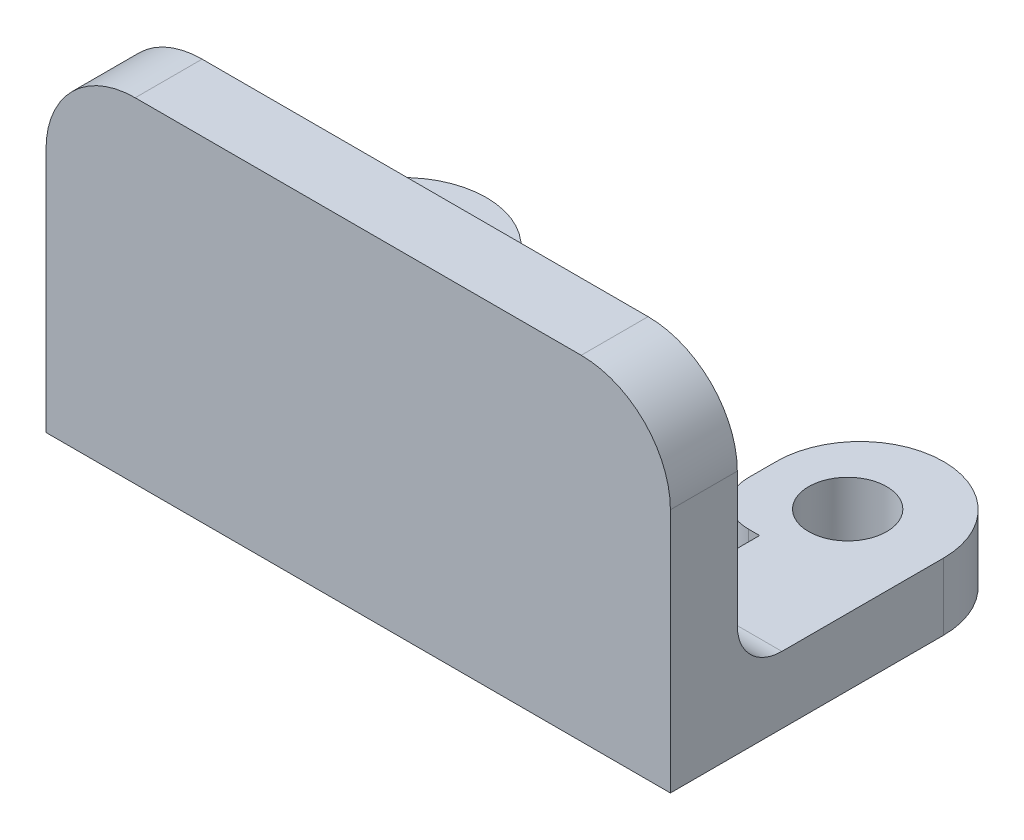
ISO-10303-21;
HEADER;
FILE_DESCRIPTION(('STEP AP214'),'2;1');
FILE_NAME('part.step','',(''),(''),'','','');
FILE_SCHEMA(('AUTOMOTIVE_DESIGN { 1 0 10303 214 1 1 1 1 }'));
ENDSEC;
DATA;
#1=APPLICATION_CONTEXT('core data for automotive mechanical design processes');
#2=APPLICATION_PROTOCOL_DEFINITION('international standard','automotive_design',2000,#1);
#3=PRODUCT_CONTEXT('',#1,'mechanical');
#4=PRODUCT('Part','Part','',(#3));
#5=PRODUCT_RELATED_PRODUCT_CATEGORY('part','',(#4));
#6=PRODUCT_DEFINITION_FORMATION('','',#4);
#7=PRODUCT_DEFINITION_CONTEXT('part definition',#1,'design');
#8=PRODUCT_DEFINITION('design','',#6,#7);
#9=PRODUCT_DEFINITION_SHAPE('','',#8);
#10=(LENGTH_UNIT() NAMED_UNIT(*) SI_UNIT(.MILLI.,.METRE.));
#11=(NAMED_UNIT(*) PLANE_ANGLE_UNIT() SI_UNIT($,.RADIAN.));
#12=(NAMED_UNIT(*) SI_UNIT($,.STERADIAN.) SOLID_ANGLE_UNIT());
#13=UNCERTAINTY_MEASURE_WITH_UNIT(LENGTH_MEASURE(1.E-05),#10,'distance_accuracy_value','');
#14=(GEOMETRIC_REPRESENTATION_CONTEXT(3) GLOBAL_UNCERTAINTY_ASSIGNED_CONTEXT((#13)) GLOBAL_UNIT_ASSIGNED_CONTEXT((#10,
#11,#12)) REPRESENTATION_CONTEXT('',''));
#15=CARTESIAN_POINT('',(0.,0.,0.));
#16=DIRECTION('',(0.,0.,1.));
#17=DIRECTION('',(1.,0.,0.));
#18=AXIS2_PLACEMENT_3D('',#15,#16,#17);
#19=CARTESIAN_POINT('',(-14.,-1.5,8.));
#20=DIRECTION('',(0.,-1.,0.));
#21=DIRECTION('',(0.,0.,-1.));
#22=AXIS2_PLACEMENT_3D('',#19,#20,#21);
#23=PLANE('',#22);
#24=DIRECTION('',(1.,0.,0.));
#25=VECTOR('',#24,1.);
#26=CARTESIAN_POINT('',(-14.,-1.5,-1.00000000000001));
#27=LINE('',#26,#25);
#28=CARTESIAN_POINT('',(8.5,-1.5,-0.999999999999994));
#29=VERTEX_POINT('',#28);
#30=CARTESIAN_POINT('',(9.,-1.5,-0.999999999999994));
#31=VERTEX_POINT('',#30);
#32=EDGE_CURVE('E543',#29,#31,#27,.T.);
#33=ORIENTED_EDGE('',*,*,#32,.F.);
#34=CARTESIAN_POINT('',(8.5,-1.5,-2.99999999999999));
#35=DIRECTION('',(0.,-1.,0.));
#36=DIRECTION('',(0.,0.,-1.));
#37=AXIS2_PLACEMENT_3D('',#34,#35,#36);
#38=CIRCLE('',#37,2.);
#39=CARTESIAN_POINT('',(6.5,-1.5,-2.99999999999999));
#40=VERTEX_POINT('',#39);
#41=EDGE_CURVE('E463',#29,#40,#38,.T.);
#42=ORIENTED_EDGE('',*,*,#41,.T.);
#43=DIRECTION('',(0.,0.,-1.));
#44=VECTOR('',#43,1.);
#45=CARTESIAN_POINT('',(6.5,-1.5,7.99999999999999));
#46=LINE('',#45,#44);
#47=CARTESIAN_POINT('',(6.5,-1.5,-4.25));
#48=VERTEX_POINT('',#47);
#49=EDGE_CURVE('E389',#40,#48,#46,.T.);
#50=ORIENTED_EDGE('',*,*,#49,.T.);
#51=CARTESIAN_POINT('',(10.25,-1.5,-4.25));
#52=DIRECTION('',(0.,-1.,0.));
#53=DIRECTION('',(0.,0.,-1.));
#54=AXIS2_PLACEMENT_3D('',#51,#52,#53);
#55=CIRCLE('',#54,3.75);
#56=CARTESIAN_POINT('',(14.,-1.5,-4.25));
#57=VERTEX_POINT('',#56);
#58=EDGE_CURVE('E381',#48,#57,#55,.T.);
#59=ORIENTED_EDGE('',*,*,#58,.T.);
#60=DIRECTION('',(0.,0.,-1.));
#61=VECTOR('',#60,1.);
#62=CARTESIAN_POINT('',(14.,-1.5,8.));
#63=LINE('',#62,#61);
#64=CARTESIAN_POINT('',(14.,-1.5,8.));
#65=VERTEX_POINT('',#64);
#66=EDGE_CURVE('E369',#65,#57,#63,.T.);
#67=ORIENTED_EDGE('',*,*,#66,.F.);
#68=DIRECTION('',(1.,0.,0.));
#69=VECTOR('',#68,1.);
#70=CARTESIAN_POINT('',(-14.,-1.5,8.));
#71=LINE('',#70,#69);
#72=CARTESIAN_POINT('',(-14.,-1.5,8.));
#73=VERTEX_POINT('',#72);
#74=EDGE_CURVE('E372',#73,#65,#71,.T.);
#75=ORIENTED_EDGE('',*,*,#74,.F.);
#76=DIRECTION('',(0.,0.,-1.));
#77=VECTOR('',#76,1.);
#78=CARTESIAN_POINT('',(-14.,-1.5,8.));
#79=LINE('',#78,#77);
#80=CARTESIAN_POINT('',(-14.,-1.5,-4.25));
#81=VERTEX_POINT('',#80);
#82=EDGE_CURVE('E392',#73,#81,#79,.T.);
#83=ORIENTED_EDGE('',*,*,#82,.T.);
#84=CARTESIAN_POINT('',(-10.25,-1.5,-4.25));
#85=DIRECTION('',(0.,-1.,0.));
#86=DIRECTION('',(0.,0.,-1.));
#87=AXIS2_PLACEMENT_3D('',#84,#85,#86);
#88=CIRCLE('',#87,3.75);
#89=CARTESIAN_POINT('',(-6.5,-1.5,-4.25));
#90=VERTEX_POINT('',#89);
#91=EDGE_CURVE('E510',#90,#81,#88,.F.);
#92=ORIENTED_EDGE('',*,*,#91,.F.);
#93=DIRECTION('',(0.,0.,-1.));
#94=VECTOR('',#93,1.);
#95=CARTESIAN_POINT('',(-6.5,-1.5,8.));
#96=LINE('',#95,#94);
#97=CARTESIAN_POINT('',(-6.5,-1.5,-3.));
#98=VERTEX_POINT('',#97);
#99=EDGE_CURVE('E527',#98,#90,#96,.T.);
#100=ORIENTED_EDGE('',*,*,#99,.F.);
#101=CARTESIAN_POINT('',(-8.5,-1.5,-3.));
#102=DIRECTION('',(0.,-1.,0.));
#103=DIRECTION('',(0.,0.,-1.));
#104=AXIS2_PLACEMENT_3D('',#101,#102,#103);
#105=CIRCLE('',#104,2.);
#106=CARTESIAN_POINT('',(-8.5,-1.5,-0.999999999999995));
#107=VERTEX_POINT('',#106);
#108=EDGE_CURVE('E231',#98,#107,#105,.T.);
#109=ORIENTED_EDGE('',*,*,#108,.T.);
#110=DIRECTION('',(-1.,0.,0.));
#111=VECTOR('',#110,1.);
#112=CARTESIAN_POINT('',(-14.,-1.5,-0.999999999999992));
#113=LINE('',#112,#111);
#114=CARTESIAN_POINT('',(-9.,-1.5,-0.999999999999995));
#115=VERTEX_POINT('',#114);
#116=EDGE_CURVE('E477',#107,#115,#113,.T.);
#117=ORIENTED_EDGE('',*,*,#116,.T.);
#118=DIRECTION('',(0.,0.,1.));
#119=VECTOR('',#118,1.);
#120=CARTESIAN_POINT('',(-9.,-1.5,8.));
#121=LINE('',#120,#119);
#122=CARTESIAN_POINT('',(-9.,-1.5,2.));
#123=VERTEX_POINT('',#122);
#124=EDGE_CURVE('E532',#115,#123,#121,.T.);
#125=ORIENTED_EDGE('',*,*,#124,.T.);
#126=DIRECTION('',(1.,0.,0.));
#127=VECTOR('',#126,1.);
#128=CARTESIAN_POINT('',(-14.,-1.5,2.));
#129=LINE('',#128,#127);
#130=CARTESIAN_POINT('',(9.,-1.5,2.));
#131=VERTEX_POINT('',#130);
#132=EDGE_CURVE('E536',#123,#131,#129,.T.);
#133=ORIENTED_EDGE('',*,*,#132,.T.);
#134=DIRECTION('',(0.,0.,1.));
#135=VECTOR('',#134,1.);
#136=CARTESIAN_POINT('',(9.,-1.5,8.));
#137=LINE('',#136,#135);
#138=EDGE_CURVE('E540',#31,#131,#137,.T.);
#139=ORIENTED_EDGE('',*,*,#138,.F.);
#140=EDGE_LOOP('',(#33,#42,#50,#59,#67,#75,#83,#92,#100,#109,#117,#125,#133,#139));
#141=FACE_BOUND('',#140,.T.);
#142=CARTESIAN_POINT('',(9.95,-1.5,-4.));
#143=DIRECTION('',(0.,-1.,0.));
#144=DIRECTION('',(0.,0.,-1.));
#145=AXIS2_PLACEMENT_3D('',#142,#143,#144);
#146=CIRCLE('',#145,1.75);
#147=CARTESIAN_POINT('',(9.95,-1.5,-5.75));
#148=VERTEX_POINT('',#147);
#149=EDGE_CURVE('E838',#148,#148,#146,.T.);
#150=ORIENTED_EDGE('',*,*,#149,.F.);
#151=EDGE_LOOP('',(#150));
#152=FACE_BOUND('',#151,.T.);
#153=CARTESIAN_POINT('',(-9.95,-1.5,-4.));
#154=DIRECTION('',(0.,-1.,0.));
#155=DIRECTION('',(0.,0.,-1.));
#156=AXIS2_PLACEMENT_3D('',#153,#154,#155);
#157=CIRCLE('',#156,1.75);
#158=CARTESIAN_POINT('',(-9.95,-1.5,-5.75));
#159=VERTEX_POINT('',#158);
#160=EDGE_CURVE('E826',#159,#159,#157,.F.);
#161=ORIENTED_EDGE('',*,*,#160,.T.);
#162=EDGE_LOOP('',(#161));
#163=FACE_BOUND('',#162,.T.);
#164=ADVANCED_FACE('F215',(#141,#152,#163),#23,.T.);
#165=CARTESIAN_POINT('',(-14.,1.5,3.));
#166=DIRECTION('',(0.,1.,0.));
#167=DIRECTION('',(0.,0.,1.));
#168=AXIS2_PLACEMENT_3D('',#165,#166,#167);
#169=PLANE('',#168);
#170=DIRECTION('',(0.,0.,1.));
#171=VECTOR('',#170,1.);
#172=CARTESIAN_POINT('',(6.5,1.5,0.));
#173=LINE('',#172,#171);
#174=CARTESIAN_POINT('',(6.5,1.5,-4.25));
#175=VERTEX_POINT('',#174);
#176=CARTESIAN_POINT('',(6.5,1.5,-2.99999999999999));
#177=VERTEX_POINT('',#176);
#178=EDGE_CURVE('E360',#175,#177,#173,.T.);
#179=ORIENTED_EDGE('',*,*,#178,.T.);
#180=CARTESIAN_POINT('',(8.5,1.5,-2.99999999999999));
#181=DIRECTION('',(0.,1.,0.));
#182=DIRECTION('',(0.,0.,1.));
#183=AXIS2_PLACEMENT_3D('',#180,#181,#182);
#184=CIRCLE('',#183,2.);
#185=CARTESIAN_POINT('',(8.5,1.5,-0.999999999999994));
#186=VERTEX_POINT('',#185);
#187=EDGE_CURVE('E455',#177,#186,#184,.T.);
#188=ORIENTED_EDGE('',*,*,#187,.T.);
#189=DIRECTION('',(-1.,0.,0.));
#190=VECTOR('',#189,1.);
#191=CARTESIAN_POINT('',(0.,1.5,-0.999999999999998));
#192=LINE('',#191,#190);
#193=CARTESIAN_POINT('',(9.,1.5,-0.999999999999994));
#194=VERTEX_POINT('',#193);
#195=EDGE_CURVE('E502',#194,#186,#192,.T.);
#196=ORIENTED_EDGE('',*,*,#195,.F.);
#197=DIRECTION('',(0.,0.,-1.));
#198=VECTOR('',#197,1.);
#199=CARTESIAN_POINT('',(9.,1.5,0.));
#200=LINE('',#199,#198);
#201=CARTESIAN_POINT('',(9.,1.5,2.));
#202=VERTEX_POINT('',#201);
#203=EDGE_CURVE('E498',#202,#194,#200,.T.);
#204=ORIENTED_EDGE('',*,*,#203,.F.);
#205=DIRECTION('',(-1.,0.,0.));
#206=VECTOR('',#205,1.);
#207=CARTESIAN_POINT('',(0.,1.5,2.));
#208=LINE('',#207,#206);
#209=CARTESIAN_POINT('',(-9.,1.5,2.));
#210=VERTEX_POINT('',#209);
#211=EDGE_CURVE('E490',#202,#210,#208,.T.);
#212=ORIENTED_EDGE('',*,*,#211,.T.);
#213=DIRECTION('',(0.,0.,-1.));
#214=VECTOR('',#213,1.);
#215=CARTESIAN_POINT('',(-9.,1.5,0.));
#216=LINE('',#215,#214);
#217=CARTESIAN_POINT('',(-9.,1.5,-0.999999999999995));
#218=VERTEX_POINT('',#217);
#219=EDGE_CURVE('E482',#210,#218,#216,.T.);
#220=ORIENTED_EDGE('',*,*,#219,.T.);
#221=DIRECTION('',(1.,0.,0.));
#222=VECTOR('',#221,1.);
#223=CARTESIAN_POINT('',(0.,1.5,-1.));
#224=LINE('',#223,#222);
#225=CARTESIAN_POINT('',(-8.5,1.5,-0.999999999999996));
#226=VERTEX_POINT('',#225);
#227=EDGE_CURVE('E475',#218,#226,#224,.T.);
#228=ORIENTED_EDGE('',*,*,#227,.T.);
#229=CARTESIAN_POINT('',(-8.5,1.5,-3.));
#230=DIRECTION('',(0.,1.,0.));
#231=DIRECTION('',(0.,0.,1.));
#232=AXIS2_PLACEMENT_3D('',#229,#230,#231);
#233=CIRCLE('',#232,2.);
#234=CARTESIAN_POINT('',(-6.5,1.5,-3.));
#235=VERTEX_POINT('',#234);
#236=EDGE_CURVE('E452',#226,#235,#233,.T.);
#237=ORIENTED_EDGE('',*,*,#236,.T.);
#238=DIRECTION('',(0.,0.,1.));
#239=VECTOR('',#238,1.);
#240=CARTESIAN_POINT('',(-6.5,1.5,0.));
#241=LINE('',#240,#239);
#242=CARTESIAN_POINT('',(-6.5,1.5,-4.25));
#243=VERTEX_POINT('',#242);
#244=EDGE_CURVE('E484',#243,#235,#241,.T.);
#245=ORIENTED_EDGE('',*,*,#244,.F.);
#246=CARTESIAN_POINT('',(-10.25,1.5,-4.25));
#247=DIRECTION('',(0.,1.,0.));
#248=DIRECTION('',(0.,0.,1.));
#249=AXIS2_PLACEMENT_3D('',#246,#247,#248);
#250=CIRCLE('',#249,3.75);
#251=CARTESIAN_POINT('',(-14.,1.5,-4.25));
#252=VERTEX_POINT('',#251);
#253=EDGE_CURVE('E492',#252,#243,#250,.F.);
#254=ORIENTED_EDGE('',*,*,#253,.F.);
#255=DIRECTION('',(0.,0.,1.));
#256=VECTOR('',#255,1.);
#257=CARTESIAN_POINT('',(-14.,1.5,3.));
#258=LINE('',#257,#256);
#259=CARTESIAN_POINT('',(-14.,1.5,3.));
#260=VERTEX_POINT('',#259);
#261=EDGE_CURVE('E402',#252,#260,#258,.T.);
#262=ORIENTED_EDGE('',*,*,#261,.T.);
#263=DIRECTION('',(1.,0.,0.));
#264=VECTOR('',#263,1.);
#265=CARTESIAN_POINT('',(-14.,1.5,3.));
#266=LINE('',#265,#264);
#267=CARTESIAN_POINT('',(14.,1.5,3.));
#268=VERTEX_POINT('',#267);
#269=EDGE_CURVE('E377',#260,#268,#266,.T.);
#270=ORIENTED_EDGE('',*,*,#269,.T.);
#271=DIRECTION('',(0.,0.,1.));
#272=VECTOR('',#271,1.);
#273=CARTESIAN_POINT('',(14.,1.5,3.));
#274=LINE('',#273,#272);
#275=CARTESIAN_POINT('',(14.,1.5,-4.25));
#276=VERTEX_POINT('',#275);
#277=EDGE_CURVE('E366',#276,#268,#274,.T.);
#278=ORIENTED_EDGE('',*,*,#277,.F.);
#279=CARTESIAN_POINT('',(10.25,1.5,-4.25));
#280=DIRECTION('',(0.,1.,0.));
#281=DIRECTION('',(0.,0.,1.));
#282=AXIS2_PLACEMENT_3D('',#279,#280,#281);
#283=CIRCLE('',#282,3.75);
#284=EDGE_CURVE('E346',#276,#175,#283,.T.);
#285=ORIENTED_EDGE('',*,*,#284,.T.);
#286=EDGE_LOOP('',(#179,#188,#196,#204,#212,#220,#228,#237,#245,#254,#262,#270,#278,#285));
#287=FACE_BOUND('',#286,.T.);
#288=CARTESIAN_POINT('',(9.95,1.5,-4.));
#289=DIRECTION('',(0.,1.,0.));
#290=DIRECTION('',(0.,0.,1.));
#291=AXIS2_PLACEMENT_3D('',#288,#289,#290);
#292=CIRCLE('',#291,1.75);
#293=CARTESIAN_POINT('',(9.95,1.5,-2.25));
#294=VERTEX_POINT('',#293);
#295=EDGE_CURVE('E832',#294,#294,#292,.T.);
#296=ORIENTED_EDGE('',*,*,#295,.F.);
#297=EDGE_LOOP('',(#296));
#298=FACE_BOUND('',#297,.T.);
#299=CARTESIAN_POINT('',(-9.95,1.5,-4.));
#300=DIRECTION('',(0.,1.,0.));
#301=DIRECTION('',(0.,0.,1.));
#302=AXIS2_PLACEMENT_3D('',#299,#300,#301);
#303=CIRCLE('',#302,1.75);
#304=CARTESIAN_POINT('',(-9.95,1.5,-2.25));
#305=VERTEX_POINT('',#304);
#306=EDGE_CURVE('E829',#305,#305,#303,.F.);
#307=ORIENTED_EDGE('',*,*,#306,.T.);
#308=EDGE_LOOP('',(#307));
#309=FACE_BOUND('',#308,.T.);
#310=ADVANCED_FACE('F374',(#287,#298,#309),#169,.T.);
#311=CARTESIAN_POINT('',(14.,3.5,3.));
#312=DIRECTION('',(1.,0.,0.));
#313=DIRECTION('',(0.,0.,-1.));
#314=AXIS2_PLACEMENT_3D('',#311,#312,#313);
#315=PLANE('',#314);
#316=DIRECTION('',(0.,1.,0.));
#317=VECTOR('',#316,1.);
#318=CARTESIAN_POINT('',(14.,3.5,5.));
#319=LINE('',#318,#317);
#320=CARTESIAN_POINT('',(14.,3.5,5.));
#321=VERTEX_POINT('',#320);
#322=CARTESIAN_POINT('',(14.,9.5,5.));
#323=VERTEX_POINT('',#322);
#324=EDGE_CURVE('E387',#321,#323,#319,.T.);
#325=ORIENTED_EDGE('',*,*,#324,.T.);
#326=DIRECTION('',(0.,0.,1.));
#327=VECTOR('',#326,1.);
#328=CARTESIAN_POINT('',(14.,9.5,3.));
#329=LINE('',#328,#327);
#330=CARTESIAN_POINT('',(14.,9.5,8.));
#331=VERTEX_POINT('',#330);
#332=EDGE_CURVE('E444',#323,#331,#329,.T.);
#333=ORIENTED_EDGE('',*,*,#332,.T.);
#334=DIRECTION('',(0.,-1.,0.));
#335=VECTOR('',#334,1.);
#336=CARTESIAN_POINT('',(14.,1.5,8.));
#337=LINE('',#336,#335);
#338=EDGE_CURVE('E397',#331,#65,#337,.T.);
#339=ORIENTED_EDGE('',*,*,#338,.T.);
#340=ORIENTED_EDGE('',*,*,#66,.T.);
#341=DIRECTION('',(0.,1.,0.));
#342=VECTOR('',#341,1.);
#343=CARTESIAN_POINT('',(14.,-28.5,-4.25));
#344=LINE('',#343,#342);
#345=EDGE_CURVE('E350',#57,#276,#344,.T.);
#346=ORIENTED_EDGE('',*,*,#345,.T.);
#347=ORIENTED_EDGE('',*,*,#277,.T.);
#348=CARTESIAN_POINT('',(14.,3.5,3.));
#349=DIRECTION('',(-1.,0.,0.));
#350=DIRECTION('',(0.,0.,-1.));
#351=AXIS2_PLACEMENT_3D('',#348,#349,#350);
#352=CIRCLE('',#351,2.);
#353=EDGE_CURVE('E380',#268,#321,#352,.T.);
#354=ORIENTED_EDGE('',*,*,#353,.T.);
#355=EDGE_LOOP('',(#325,#333,#339,#340,#346,#347,#354));
#356=FACE_BOUND('',#355,.T.);
#357=ADVANCED_FACE('F364',(#356),#315,.T.);
#358=CARTESIAN_POINT('',(-14.,1.5,8.));
#359=DIRECTION('',(0.,0.,1.));
#360=DIRECTION('',(1.,0.,0.));
#361=AXIS2_PLACEMENT_3D('',#358,#359,#360);
#362=PLANE('',#361);
#363=DIRECTION('',(1.,0.,0.));
#364=VECTOR('',#363,1.);
#365=CARTESIAN_POINT('',(-14.,13.5,8.));
#366=LINE('',#365,#364);
#367=CARTESIAN_POINT('',(-10.,13.5,8.));
#368=VERTEX_POINT('',#367);
#369=CARTESIAN_POINT('',(10.,13.5,8.));
#370=VERTEX_POINT('',#369);
#371=EDGE_CURVE('E406',#368,#370,#366,.T.);
#372=ORIENTED_EDGE('',*,*,#371,.F.);
#373=CARTESIAN_POINT('',(-10.,9.5,8.));
#374=DIRECTION('',(0.,0.,1.));
#375=DIRECTION('',(1.,0.,0.));
#376=AXIS2_PLACEMENT_3D('',#373,#374,#375);
#377=CIRCLE('',#376,4.);
#378=CARTESIAN_POINT('',(-14.,9.5,8.));
#379=VERTEX_POINT('',#378);
#380=EDGE_CURVE('E432',#368,#379,#377,.T.);
#381=ORIENTED_EDGE('',*,*,#380,.T.);
#382=DIRECTION('',(0.,-1.,0.));
#383=VECTOR('',#382,1.);
#384=CARTESIAN_POINT('',(-14.,1.5,8.));
#385=LINE('',#384,#383);
#386=EDGE_CURVE('E557',#379,#73,#385,.T.);
#387=ORIENTED_EDGE('',*,*,#386,.T.);
#388=ORIENTED_EDGE('',*,*,#74,.T.);
#389=ORIENTED_EDGE('',*,*,#338,.F.);
#390=CARTESIAN_POINT('',(10.,9.5,8.));
#391=DIRECTION('',(0.,0.,1.));
#392=DIRECTION('',(1.,0.,0.));
#393=AXIS2_PLACEMENT_3D('',#390,#391,#392);
#394=CIRCLE('',#393,4.);
#395=EDGE_CURVE('E429',#331,#370,#394,.T.);
#396=ORIENTED_EDGE('',*,*,#395,.T.);
#397=EDGE_LOOP('',(#372,#381,#387,#388,#389,#396));
#398=FACE_BOUND('',#397,.T.);
#399=ADVANCED_FACE('F600',(#398),#362,.T.);
#400=CARTESIAN_POINT('',(-14.,13.5,8.));
#401=DIRECTION('',(0.,1.,0.));
#402=DIRECTION('',(0.,0.,1.));
#403=AXIS2_PLACEMENT_3D('',#400,#401,#402);
#404=PLANE('',#403);
#405=DIRECTION('',(1.,0.,0.));
#406=VECTOR('',#405,1.);
#407=CARTESIAN_POINT('',(-14.,13.5,5.));
#408=LINE('',#407,#406);
#409=CARTESIAN_POINT('',(-10.,13.5,5.));
#410=VERTEX_POINT('',#409);
#411=CARTESIAN_POINT('',(10.,13.5,5.));
#412=VERTEX_POINT('',#411);
#413=EDGE_CURVE('E410',#410,#412,#408,.T.);
#414=ORIENTED_EDGE('',*,*,#413,.F.);
#415=DIRECTION('',(0.,0.,1.));
#416=VECTOR('',#415,1.);
#417=CARTESIAN_POINT('',(-10.,13.5,8.));
#418=LINE('',#417,#416);
#419=EDGE_CURVE('E425',#410,#368,#418,.T.);
#420=ORIENTED_EDGE('',*,*,#419,.T.);
#421=ORIENTED_EDGE('',*,*,#371,.T.);
#422=DIRECTION('',(0.,0.,1.));
#423=VECTOR('',#422,1.);
#424=CARTESIAN_POINT('',(10.,13.5,8.));
#425=LINE('',#424,#423);
#426=EDGE_CURVE('E422',#370,#412,#425,.F.);
#427=ORIENTED_EDGE('',*,*,#426,.T.);
#428=EDGE_LOOP('',(#414,#420,#421,#427));
#429=FACE_BOUND('',#428,.T.);
#430=ADVANCED_FACE('F603',(#429),#404,.T.);
#431=CARTESIAN_POINT('',(-14.,3.5,5.));
#432=DIRECTION('',(0.,0.,-1.));
#433=DIRECTION('',(-1.,0.,0.));
#434=AXIS2_PLACEMENT_3D('',#431,#432,#433);
#435=PLANE('',#434);
#436=DIRECTION('',(0.,1.,0.));
#437=VECTOR('',#436,1.);
#438=CARTESIAN_POINT('',(-14.,3.5,5.));
#439=LINE('',#438,#437);
#440=CARTESIAN_POINT('',(-14.,3.5,5.));
#441=VERTEX_POINT('',#440);
#442=CARTESIAN_POINT('',(-14.,9.5,5.));
#443=VERTEX_POINT('',#442);
#444=EDGE_CURVE('E554',#441,#443,#439,.T.);
#445=ORIENTED_EDGE('',*,*,#444,.T.);
#446=CARTESIAN_POINT('',(-10.,9.5,5.));
#447=DIRECTION('',(0.,0.,-1.));
#448=DIRECTION('',(-1.,0.,0.));
#449=AXIS2_PLACEMENT_3D('',#446,#447,#448);
#450=CIRCLE('',#449,4.);
#451=EDGE_CURVE('E441',#443,#410,#450,.T.);
#452=ORIENTED_EDGE('',*,*,#451,.T.);
#453=ORIENTED_EDGE('',*,*,#413,.T.);
#454=CARTESIAN_POINT('',(10.,9.5,5.));
#455=DIRECTION('',(0.,0.,-1.));
#456=DIRECTION('',(-1.,0.,0.));
#457=AXIS2_PLACEMENT_3D('',#454,#455,#456);
#458=CIRCLE('',#457,4.);
#459=EDGE_CURVE('E438',#412,#323,#458,.T.);
#460=ORIENTED_EDGE('',*,*,#459,.T.);
#461=ORIENTED_EDGE('',*,*,#324,.F.);
#462=DIRECTION('',(1.,0.,0.));
#463=VECTOR('',#462,1.);
#464=CARTESIAN_POINT('',(-14.,3.5,5.));
#465=LINE('',#464,#463);
#466=EDGE_CURVE('E414',#441,#321,#465,.T.);
#467=ORIENTED_EDGE('',*,*,#466,.F.);
#468=EDGE_LOOP('',(#445,#452,#453,#460,#461,#467));
#469=FACE_BOUND('',#468,.T.);
#470=ADVANCED_FACE('F606',(#469),#435,.T.);
#471=CARTESIAN_POINT('',(-14.,3.5,3.));
#472=DIRECTION('',(1.,0.,0.));
#473=DIRECTION('',(0.,0.,-1.));
#474=AXIS2_PLACEMENT_3D('',#471,#472,#473);
#475=CYLINDRICAL_SURFACE('',#474,2.);
#476=ORIENTED_EDGE('',*,*,#353,.F.);
#477=ORIENTED_EDGE('',*,*,#269,.F.);
#478=CARTESIAN_POINT('',(-14.,3.5,3.));
#479=DIRECTION('',(-1.,0.,0.));
#480=DIRECTION('',(0.,0.,-1.));
#481=AXIS2_PLACEMENT_3D('',#478,#479,#480);
#482=CIRCLE('',#481,2.);
#483=EDGE_CURVE('E550',#260,#441,#482,.T.);
#484=ORIENTED_EDGE('',*,*,#483,.T.);
#485=ORIENTED_EDGE('',*,*,#466,.T.);
#486=EDGE_LOOP('',(#476,#477,#484,#485));
#487=FACE_BOUND('',#486,.T.);
#488=ADVANCED_FACE('F610',(#487),#475,.F.);
#489=CARTESIAN_POINT('',(-14.,3.5,3.));
#490=DIRECTION('',(1.,0.,0.));
#491=DIRECTION('',(0.,0.,-1.));
#492=AXIS2_PLACEMENT_3D('',#489,#490,#491);
#493=PLANE('',#492);
#494=ORIENTED_EDGE('',*,*,#386,.F.);
#495=DIRECTION('',(0.,0.,1.));
#496=VECTOR('',#495,1.);
#497=CARTESIAN_POINT('',(-14.,9.5,5.));
#498=LINE('',#497,#496);
#499=EDGE_CURVE('E435',#379,#443,#498,.F.);
#500=ORIENTED_EDGE('',*,*,#499,.T.);
#501=ORIENTED_EDGE('',*,*,#444,.F.);
#502=ORIENTED_EDGE('',*,*,#483,.F.);
#503=ORIENTED_EDGE('',*,*,#261,.F.);
#504=DIRECTION('',(0.,1.,0.));
#505=VECTOR('',#504,1.);
#506=CARTESIAN_POINT('',(-14.,-28.5,-4.25));
#507=LINE('',#506,#505);
#508=EDGE_CURVE('E371',#252,#81,#507,.F.);
#509=ORIENTED_EDGE('',*,*,#508,.T.);
#510=ORIENTED_EDGE('',*,*,#82,.F.);
#511=EDGE_LOOP('',(#494,#500,#501,#502,#503,#509,#510));
#512=FACE_BOUND('',#511,.T.);
#513=ADVANCED_FACE('F573',(#512),#493,.F.);
#514=CARTESIAN_POINT('',(10.25,-28.5,-4.25));
#515=DIRECTION('',(0.,1.,0.));
#516=DIRECTION('',(0.,0.,1.));
#517=AXIS2_PLACEMENT_3D('',#514,#515,#516);
#518=CYLINDRICAL_SURFACE('',#517,3.75);
#519=DIRECTION('',(0.,1.,0.));
#520=VECTOR('',#519,1.);
#521=CARTESIAN_POINT('',(6.5,-28.5,-4.25));
#522=LINE('',#521,#520);
#523=EDGE_CURVE('E353',#48,#175,#522,.T.);
#524=ORIENTED_EDGE('',*,*,#523,.T.);
#525=ORIENTED_EDGE('',*,*,#284,.F.);
#526=ORIENTED_EDGE('',*,*,#345,.F.);
#527=ORIENTED_EDGE('',*,*,#58,.F.);
#528=EDGE_LOOP('',(#524,#525,#526,#527));
#529=FACE_BOUND('',#528,.T.);
#530=ADVANCED_FACE('F348',(#529),#518,.T.);
#531=CARTESIAN_POINT('',(6.5,-28.5,0.));
#532=DIRECTION('',(-1.,0.,0.));
#533=DIRECTION('',(0.,0.,1.));
#534=AXIS2_PLACEMENT_3D('',#531,#532,#533);
#535=PLANE('',#534);
#536=ORIENTED_EDGE('',*,*,#49,.F.);
#537=DIRECTION('',(0.,1.,0.));
#538=VECTOR('',#537,1.);
#539=CARTESIAN_POINT('',(6.5,1.5,-2.99999999999999));
#540=LINE('',#539,#538);
#541=EDGE_CURVE('E448',#40,#177,#540,.T.);
#542=ORIENTED_EDGE('',*,*,#541,.T.);
#543=ORIENTED_EDGE('',*,*,#178,.F.);
#544=ORIENTED_EDGE('',*,*,#523,.F.);
#545=EDGE_LOOP('',(#536,#542,#543,#544));
#546=FACE_BOUND('',#545,.T.);
#547=ADVANCED_FACE('F635',(#546),#535,.T.);
#548=CARTESIAN_POINT('',(0.,-28.5,-0.999999999999997));
#549=DIRECTION('',(0.,0.,-1.));
#550=DIRECTION('',(-1.,0.,0.));
#551=AXIS2_PLACEMENT_3D('',#548,#549,#550);
#552=PLANE('',#551);
#553=ORIENTED_EDGE('',*,*,#195,.T.);
#554=DIRECTION('',(0.,1.,0.));
#555=VECTOR('',#554,1.);
#556=CARTESIAN_POINT('',(8.5,-1.5,-0.999999999999994));
#557=LINE('',#556,#555);
#558=EDGE_CURVE('E458',#186,#29,#557,.F.);
#559=ORIENTED_EDGE('',*,*,#558,.T.);
#560=ORIENTED_EDGE('',*,*,#32,.T.);
#561=DIRECTION('',(0.,1.,0.));
#562=VECTOR('',#561,1.);
#563=CARTESIAN_POINT('',(9.,-28.5,-0.999999999999993));
#564=LINE('',#563,#562);
#565=EDGE_CURVE('E511',#31,#194,#564,.T.);
#566=ORIENTED_EDGE('',*,*,#565,.T.);
#567=EDGE_LOOP('',(#553,#559,#560,#566));
#568=FACE_BOUND('',#567,.T.);
#569=ADVANCED_FACE('F641',(#568),#552,.F.);
#570=CARTESIAN_POINT('',(9.,-28.5,0.));
#571=DIRECTION('',(1.,0.,0.));
#572=DIRECTION('',(0.,0.,-1.));
#573=AXIS2_PLACEMENT_3D('',#570,#571,#572);
#574=PLANE('',#573);
#575=ORIENTED_EDGE('',*,*,#138,.T.);
#576=DIRECTION('',(0.,1.,0.));
#577=VECTOR('',#576,1.);
#578=CARTESIAN_POINT('',(9.,-28.5,2.));
#579=LINE('',#578,#577);
#580=EDGE_CURVE('E514',#131,#202,#579,.T.);
#581=ORIENTED_EDGE('',*,*,#580,.T.);
#582=ORIENTED_EDGE('',*,*,#203,.T.);
#583=ORIENTED_EDGE('',*,*,#565,.F.);
#584=EDGE_LOOP('',(#575,#581,#582,#583));
#585=FACE_BOUND('',#584,.T.);
#586=ADVANCED_FACE('F646',(#585),#574,.F.);
#587=CARTESIAN_POINT('',(0.,-28.5,2.));
#588=DIRECTION('',(0.,0.,-1.));
#589=DIRECTION('',(-1.,0.,0.));
#590=AXIS2_PLACEMENT_3D('',#587,#588,#589);
#591=PLANE('',#590);
#592=DIRECTION('',(0.,1.,0.));
#593=VECTOR('',#592,1.);
#594=CARTESIAN_POINT('',(-9.,-28.5,2.));
#595=LINE('',#594,#593);
#596=EDGE_CURVE('E517',#123,#210,#595,.T.);
#597=ORIENTED_EDGE('',*,*,#596,.T.);
#598=ORIENTED_EDGE('',*,*,#211,.F.);
#599=ORIENTED_EDGE('',*,*,#580,.F.);
#600=ORIENTED_EDGE('',*,*,#132,.F.);
#601=EDGE_LOOP('',(#597,#598,#599,#600));
#602=FACE_BOUND('',#601,.T.);
#603=ADVANCED_FACE('F650',(#602),#591,.T.);
#604=CARTESIAN_POINT('',(-9.,-28.5,0.));
#605=DIRECTION('',(1.,0.,0.));
#606=DIRECTION('',(0.,0.,-1.));
#607=AXIS2_PLACEMENT_3D('',#604,#605,#606);
#608=PLANE('',#607);
#609=DIRECTION('',(0.,1.,0.));
#610=VECTOR('',#609,1.);
#611=CARTESIAN_POINT('',(-9.,-28.5,-0.999999999999994));
#612=LINE('',#611,#610);
#613=EDGE_CURVE('E520',#115,#218,#612,.T.);
#614=ORIENTED_EDGE('',*,*,#613,.T.);
#615=ORIENTED_EDGE('',*,*,#219,.F.);
#616=ORIENTED_EDGE('',*,*,#596,.F.);
#617=ORIENTED_EDGE('',*,*,#124,.F.);
#618=EDGE_LOOP('',(#614,#615,#616,#617));
#619=FACE_BOUND('',#618,.T.);
#620=ADVANCED_FACE('F654',(#619),#608,.T.);
#621=CARTESIAN_POINT('',(0.,-28.5,-0.999999999999999));
#622=DIRECTION('',(0.,0.,1.));
#623=DIRECTION('',(1.,0.,0.));
#624=AXIS2_PLACEMENT_3D('',#621,#622,#623);
#625=PLANE('',#624);
#626=ORIENTED_EDGE('',*,*,#116,.F.);
#627=DIRECTION('',(0.,1.,0.));
#628=VECTOR('',#627,1.);
#629=CARTESIAN_POINT('',(-8.5,1.5,-0.999999999999996));
#630=LINE('',#629,#628);
#631=EDGE_CURVE('E224',#107,#226,#630,.T.);
#632=ORIENTED_EDGE('',*,*,#631,.T.);
#633=ORIENTED_EDGE('',*,*,#227,.F.);
#634=ORIENTED_EDGE('',*,*,#613,.F.);
#635=EDGE_LOOP('',(#626,#632,#633,#634));
#636=FACE_BOUND('',#635,.T.);
#637=ADVANCED_FACE('F473',(#636),#625,.T.);
#638=CARTESIAN_POINT('',(-6.5,-28.5,0.));
#639=DIRECTION('',(-1.,0.,0.));
#640=DIRECTION('',(0.,0.,1.));
#641=AXIS2_PLACEMENT_3D('',#638,#639,#640);
#642=PLANE('',#641);
#643=ORIENTED_EDGE('',*,*,#244,.T.);
#644=DIRECTION('',(0.,1.,0.));
#645=VECTOR('',#644,1.);
#646=CARTESIAN_POINT('',(-6.5,-1.5,-3.));
#647=LINE('',#646,#645);
#648=EDGE_CURVE('E12',#235,#98,#647,.F.);
#649=ORIENTED_EDGE('',*,*,#648,.T.);
#650=ORIENTED_EDGE('',*,*,#99,.T.);
#651=DIRECTION('',(0.,1.,0.));
#652=VECTOR('',#651,1.);
#653=CARTESIAN_POINT('',(-6.5,-28.5,-4.25));
#654=LINE('',#653,#652);
#655=EDGE_CURVE('E359',#90,#243,#654,.T.);
#656=ORIENTED_EDGE('',*,*,#655,.T.);
#657=EDGE_LOOP('',(#643,#649,#650,#656));
#658=FACE_BOUND('',#657,.T.);
#659=ADVANCED_FACE('F582',(#658),#642,.F.);
#660=CARTESIAN_POINT('',(-10.25,-28.5,-4.25));
#661=DIRECTION('',(0.,1.,0.));
#662=DIRECTION('',(0.,0.,1.));
#663=AXIS2_PLACEMENT_3D('',#660,#661,#662);
#664=CYLINDRICAL_SURFACE('',#663,3.75);
#665=ORIENTED_EDGE('',*,*,#91,.T.);
#666=ORIENTED_EDGE('',*,*,#508,.F.);
#667=ORIENTED_EDGE('',*,*,#253,.T.);
#668=ORIENTED_EDGE('',*,*,#655,.F.);
#669=EDGE_LOOP('',(#665,#666,#667,#668));
#670=FACE_BOUND('',#669,.T.);
#671=ADVANCED_FACE('F580',(#670),#664,.T.);
#672=CARTESIAN_POINT('',(9.95,-28.5,-4.));
#673=DIRECTION('',(0.,1.,0.));
#674=DIRECTION('',(0.,0.,1.));
#675=AXIS2_PLACEMENT_3D('',#672,#673,#674);
#676=CYLINDRICAL_SURFACE('',#675,1.75);
#677=ORIENTED_EDGE('',*,*,#149,.T.);
#678=EDGE_LOOP('',(#677));
#679=FACE_BOUND('',#678,.T.);
#680=ORIENTED_EDGE('',*,*,#295,.T.);
#681=EDGE_LOOP('',(#680));
#682=FACE_BOUND('',#681,.T.);
#683=ADVANCED_FACE('F668',(#679,#682),#676,.F.);
#684=CARTESIAN_POINT('',(-9.95,-28.5,-4.));
#685=DIRECTION('',(0.,1.,0.));
#686=DIRECTION('',(0.,0.,1.));
#687=AXIS2_PLACEMENT_3D('',#684,#685,#686);
#688=CYLINDRICAL_SURFACE('',#687,1.75);
#689=ORIENTED_EDGE('',*,*,#160,.F.);
#690=EDGE_LOOP('',(#689));
#691=FACE_BOUND('',#690,.T.);
#692=ORIENTED_EDGE('',*,*,#306,.F.);
#693=EDGE_LOOP('',(#692));
#694=FACE_BOUND('',#693,.T.);
#695=ADVANCED_FACE('F618',(#691,#694),#688,.F.);
#696=CARTESIAN_POINT('',(-10.,9.5,8.));
#697=DIRECTION('',(0.,0.,-1.));
#698=DIRECTION('',(0.,1.,0.));
#699=AXIS2_PLACEMENT_3D('',#696,#697,#698);
#700=CYLINDRICAL_SURFACE('',#699,4.);
#701=ORIENTED_EDGE('',*,*,#451,.F.);
#702=ORIENTED_EDGE('',*,*,#499,.F.);
#703=ORIENTED_EDGE('',*,*,#380,.F.);
#704=ORIENTED_EDGE('',*,*,#419,.F.);
#705=EDGE_LOOP('',(#701,#702,#703,#704));
#706=FACE_BOUND('',#705,.T.);
#707=ADVANCED_FACE('F615',(#706),#700,.T.);
#708=CARTESIAN_POINT('',(10.,9.5,3.));
#709=DIRECTION('',(0.,0.,1.));
#710=DIRECTION('',(0.,-1.,0.));
#711=AXIS2_PLACEMENT_3D('',#708,#709,#710);
#712=CYLINDRICAL_SURFACE('',#711,4.);
#713=ORIENTED_EDGE('',*,*,#459,.F.);
#714=ORIENTED_EDGE('',*,*,#426,.F.);
#715=ORIENTED_EDGE('',*,*,#395,.F.);
#716=ORIENTED_EDGE('',*,*,#332,.F.);
#717=EDGE_LOOP('',(#713,#714,#715,#716));
#718=FACE_BOUND('',#717,.T.);
#719=ADVANCED_FACE('F588',(#718),#712,.T.);
#720=CARTESIAN_POINT('',(8.5,-28.5,-2.99999999999999));
#721=DIRECTION('',(0.,-1.,0.));
#722=DIRECTION('',(0.,0.,-1.));
#723=AXIS2_PLACEMENT_3D('',#720,#721,#722);
#724=CYLINDRICAL_SURFACE('',#723,2.);
#725=ORIENTED_EDGE('',*,*,#41,.F.);
#726=ORIENTED_EDGE('',*,*,#558,.F.);
#727=ORIENTED_EDGE('',*,*,#187,.F.);
#728=ORIENTED_EDGE('',*,*,#541,.F.);
#729=EDGE_LOOP('',(#725,#726,#727,#728));
#730=FACE_BOUND('',#729,.T.);
#731=ADVANCED_FACE('F584',(#730),#724,.T.);
#732=CARTESIAN_POINT('',(-8.5,-28.5,-2.99999999999999));
#733=DIRECTION('',(0.,-1.,0.));
#734=DIRECTION('',(0.,0.,-1.));
#735=AXIS2_PLACEMENT_3D('',#732,#733,#734);
#736=CYLINDRICAL_SURFACE('',#735,2.);
#737=ORIENTED_EDGE('',*,*,#108,.F.);
#738=ORIENTED_EDGE('',*,*,#648,.F.);
#739=ORIENTED_EDGE('',*,*,#236,.F.);
#740=ORIENTED_EDGE('',*,*,#631,.F.);
#741=EDGE_LOOP('',(#737,#738,#739,#740));
#742=FACE_BOUND('',#741,.T.);
#743=ADVANCED_FACE('F217',(#742),#736,.T.);
#744=CLOSED_SHELL('',(#164,#310,#357,#399,#430,#470,#488,#513,#530,#547,#569,#586,#603,#620,
#637,#659,#671,#683,#695,#707,#719,#731,#743));
#745=MANIFOLD_SOLID_BREP('B2',#744);
#746=ADVANCED_BREP_SHAPE_REPRESENTATION('',(#18,#745),#14);
#747=SHAPE_DEFINITION_REPRESENTATION(#9,#746);
ENDSEC;
END-ISO-10303-21;
